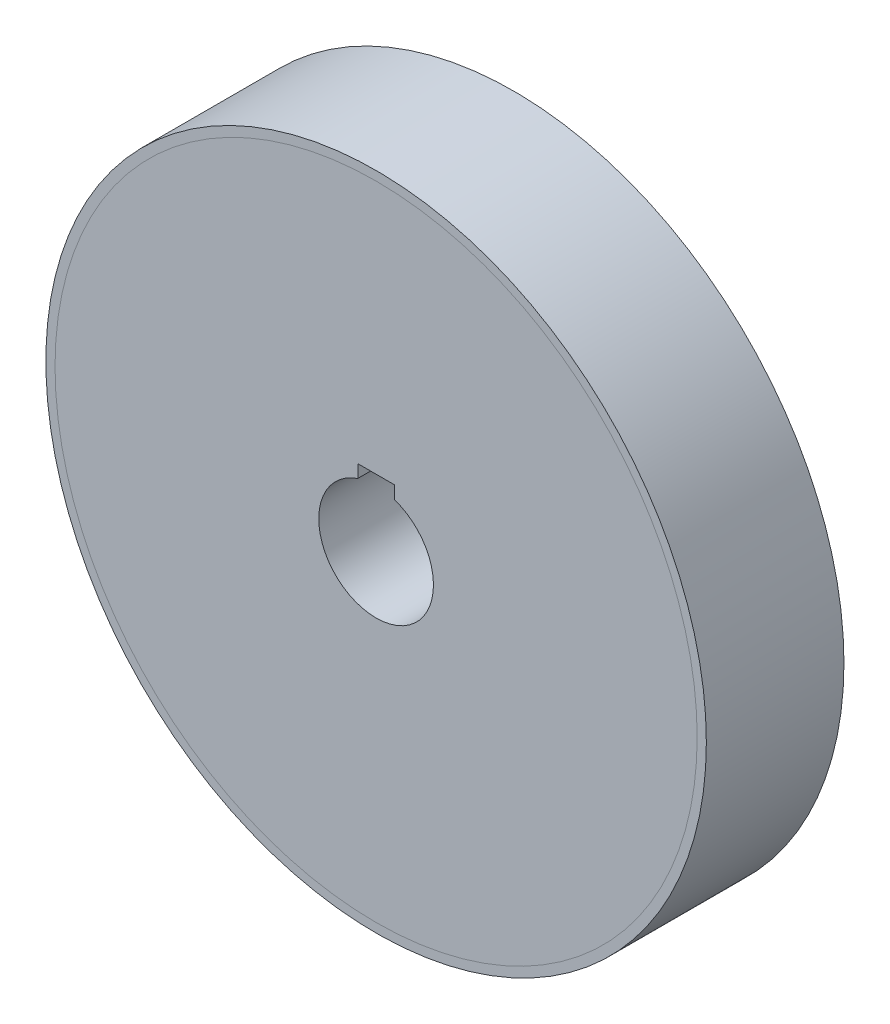
ISO-10303-21;
HEADER;
FILE_DESCRIPTION(('STEP AP214'),'2;1');
FILE_NAME('part.step','',(''),(''),'','','');
FILE_SCHEMA(('AUTOMOTIVE_DESIGN { 1 0 10303 214 1 1 1 1 }'));
ENDSEC;
DATA;
#1=APPLICATION_CONTEXT('core data for automotive mechanical design processes');
#2=APPLICATION_PROTOCOL_DEFINITION('international standard','automotive_design',2000,#1);
#3=PRODUCT_CONTEXT('',#1,'mechanical');
#4=PRODUCT('Part','Part','',(#3));
#5=PRODUCT_RELATED_PRODUCT_CATEGORY('part','',(#4));
#6=PRODUCT_DEFINITION_FORMATION('','',#4);
#7=PRODUCT_DEFINITION_CONTEXT('part definition',#1,'design');
#8=PRODUCT_DEFINITION('design','',#6,#7);
#9=PRODUCT_DEFINITION_SHAPE('','',#8);
#10=(LENGTH_UNIT() NAMED_UNIT(*) SI_UNIT(.MILLI.,.METRE.));
#11=(NAMED_UNIT(*) PLANE_ANGLE_UNIT() SI_UNIT($,.RADIAN.));
#12=(NAMED_UNIT(*) SI_UNIT($,.STERADIAN.) SOLID_ANGLE_UNIT());
#13=UNCERTAINTY_MEASURE_WITH_UNIT(LENGTH_MEASURE(1.E-05),#10,'distance_accuracy_value','');
#14=(GEOMETRIC_REPRESENTATION_CONTEXT(3) GLOBAL_UNCERTAINTY_ASSIGNED_CONTEXT((#13)) GLOBAL_UNIT_ASSIGNED_CONTEXT((#10,
#11,#12)) REPRESENTATION_CONTEXT('',''));
#15=CARTESIAN_POINT('',(0.,0.,0.));
#16=DIRECTION('',(0.,0.,1.));
#17=DIRECTION('',(1.,0.,0.));
#18=AXIS2_PLACEMENT_3D('',#15,#16,#17);
#19=CARTESIAN_POINT('',(0.,0.,-407.293505963451));
#20=DIRECTION('',(0.,0.,1.));
#21=DIRECTION('',(1.,0.,0.));
#22=AXIS2_PLACEMENT_3D('',#19,#20,#21);
#23=CYLINDRICAL_SURFACE('',#22,144.);
#24=CARTESIAN_POINT('',(0.,0.,0.));
#25=DIRECTION('',(0.,0.,1.));
#26=DIRECTION('',(1.,0.,0.));
#27=AXIS2_PLACEMENT_3D('',#24,#25,#26);
#28=CIRCLE('',#27,144.);
#29=CARTESIAN_POINT('',(144.,0.,0.));
#30=VERTEX_POINT('',#29);
#31=EDGE_CURVE('E64',#30,#30,#28,.F.);
#32=ORIENTED_EDGE('',*,*,#31,.F.);
#33=EDGE_LOOP('',(#32));
#34=FACE_BOUND('',#33,.T.);
#35=CARTESIAN_POINT('',(0.,0.,60.));
#36=DIRECTION('',(0.,0.,1.));
#37=DIRECTION('',(1.,0.,0.));
#38=AXIS2_PLACEMENT_3D('',#35,#36,#37);
#39=CIRCLE('',#38,144.);
#40=CARTESIAN_POINT('',(144.,0.,60.));
#41=VERTEX_POINT('',#40);
#42=EDGE_CURVE('E68',#41,#41,#39,.T.);
#43=ORIENTED_EDGE('',*,*,#42,.F.);
#44=EDGE_LOOP('',(#43));
#45=FACE_BOUND('',#44,.T.);
#46=ADVANCED_FACE('F58',(#34,#45),#23,.T.);
#47=CARTESIAN_POINT('',(0.,0.,60.));
#48=DIRECTION('',(0.,0.,1.));
#49=DIRECTION('',(1.,0.,0.));
#50=AXIS2_PLACEMENT_3D('',#47,#48,#49);
#51=PLANE('',#50);
#52=CARTESIAN_POINT('',(0.,0.,60.));
#53=DIRECTION('',(0.,0.,1.));
#54=DIRECTION('',(1.,0.,0.));
#55=AXIS2_PLACEMENT_3D('',#52,#53,#54);
#56=CIRCLE('',#55,140.);
#57=CARTESIAN_POINT('',(140.,0.,60.));
#58=VERTEX_POINT('',#57);
#59=EDGE_CURVE('E73',#58,#58,#56,.T.);
#60=ORIENTED_EDGE('',*,*,#59,.F.);
#61=EDGE_LOOP('',(#60));
#62=FACE_BOUND('',#61,.T.);
#63=ORIENTED_EDGE('',*,*,#42,.T.);
#64=EDGE_LOOP('',(#63));
#65=FACE_BOUND('',#64,.T.);
#66=ADVANCED_FACE('F80',(#62,#65),#51,.T.);
#67=CARTESIAN_POINT('',(0.,0.,-407.293505963451));
#68=DIRECTION('',(0.,0.,1.));
#69=DIRECTION('',(1.,0.,0.));
#70=AXIS2_PLACEMENT_3D('',#67,#68,#69);
#71=CYLINDRICAL_SURFACE('',#70,140.);
#72=CARTESIAN_POINT('',(0.,0.,0.));
#73=DIRECTION('',(0.,0.,1.));
#74=DIRECTION('',(1.,0.,0.));
#75=AXIS2_PLACEMENT_3D('',#72,#73,#74);
#76=CIRCLE('',#75,140.);
#77=CARTESIAN_POINT('',(140.,0.,0.));
#78=VERTEX_POINT('',#77);
#79=EDGE_CURVE('E13',#78,#78,#76,.F.);
#80=ORIENTED_EDGE('',*,*,#79,.T.);
#81=EDGE_LOOP('',(#80));
#82=FACE_BOUND('',#81,.T.);
#83=ORIENTED_EDGE('',*,*,#59,.T.);
#84=EDGE_LOOP('',(#83));
#85=FACE_BOUND('',#84,.T.);
#86=ADVANCED_FACE('F78',(#82,#85),#71,.F.);
#87=CARTESIAN_POINT('',(0.,0.,0.));
#88=DIRECTION('',(0.,0.,1.));
#89=DIRECTION('',(1.,0.,0.));
#90=AXIS2_PLACEMENT_3D('',#87,#88,#89);
#91=PLANE('',#90);
#92=ORIENTED_EDGE('',*,*,#31,.T.);
#93=EDGE_LOOP('',(#92));
#94=FACE_BOUND('',#93,.T.);
#95=ORIENTED_EDGE('',*,*,#79,.F.);
#96=EDGE_LOOP('',(#95));
#97=FACE_BOUND('',#96,.T.);
#98=ADVANCED_FACE('F99',(#94,#97),#91,.F.);
#99=CLOSED_SHELL('',(#46,#66,#86,#98));
#100=MANIFOLD_SOLID_BREP('B2',#99);
#101=CARTESIAN_POINT('',(0.,0.,60.));
#102=DIRECTION('',(0.,0.,-1.));
#103=DIRECTION('',(-1.,0.,0.));
#104=AXIS2_PLACEMENT_3D('',#101,#102,#103);
#105=CYLINDRICAL_SURFACE('',#104,140.);
#106=CARTESIAN_POINT('',(0.,0.,60.));
#107=DIRECTION('',(0.,0.,1.));
#108=DIRECTION('',(1.,0.,0.));
#109=AXIS2_PLACEMENT_3D('',#106,#107,#108);
#110=CIRCLE('',#109,140.);
#111=CARTESIAN_POINT('',(140.,0.,60.));
#112=VERTEX_POINT('',#111);
#113=EDGE_CURVE('E56',#112,#112,#110,.T.);
#114=ORIENTED_EDGE('',*,*,#113,.F.);
#115=EDGE_LOOP('',(#114));
#116=FACE_BOUND('',#115,.T.);
#117=CARTESIAN_POINT('',(0.,0.,0.));
#118=DIRECTION('',(0.,0.,1.));
#119=DIRECTION('',(1.,0.,0.));
#120=AXIS2_PLACEMENT_3D('',#117,#118,#119);
#121=CIRCLE('',#120,140.);
#122=CARTESIAN_POINT('',(140.,0.,0.));
#123=VERTEX_POINT('',#122);
#124=EDGE_CURVE('E120',#123,#123,#121,.T.);
#125=ORIENTED_EDGE('',*,*,#124,.T.);
#126=EDGE_LOOP('',(#125));
#127=FACE_BOUND('',#126,.T.);
#128=ADVANCED_FACE('F117',(#116,#127),#105,.T.);
#129=CARTESIAN_POINT('',(0.,0.,60.));
#130=DIRECTION('',(0.,0.,1.));
#131=DIRECTION('',(1.,0.,0.));
#132=AXIS2_PLACEMENT_3D('',#129,#130,#131);
#133=PLANE('',#132);
#134=DIRECTION('',(0.,-1.,0.));
#135=VECTOR('',#134,1.);
#136=CARTESIAN_POINT('',(-8.,23.685438564654,60.));
#137=LINE('',#136,#135);
#138=CARTESIAN_POINT('',(-8.,29.3,60.));
#139=VERTEX_POINT('',#138);
#140=CARTESIAN_POINT('',(-8.,23.685438564654,60.));
#141=VERTEX_POINT('',#140);
#142=EDGE_CURVE('E156',#139,#141,#137,.T.);
#143=ORIENTED_EDGE('',*,*,#142,.F.);
#144=DIRECTION('',(-1.,0.,0.));
#145=VECTOR('',#144,1.);
#146=CARTESIAN_POINT('',(-8.,29.3,60.));
#147=LINE('',#146,#145);
#148=CARTESIAN_POINT('',(8.,29.3,60.));
#149=VERTEX_POINT('',#148);
#150=EDGE_CURVE('E181',#149,#139,#147,.T.);
#151=ORIENTED_EDGE('',*,*,#150,.F.);
#152=DIRECTION('',(0.,1.,0.));
#153=VECTOR('',#152,1.);
#154=CARTESIAN_POINT('',(8.,23.685438564654,60.));
#155=LINE('',#154,#153);
#156=CARTESIAN_POINT('',(8.,23.685438564654,60.));
#157=VERTEX_POINT('',#156);
#158=EDGE_CURVE('E162',#157,#149,#155,.T.);
#159=ORIENTED_EDGE('',*,*,#158,.F.);
#160=CARTESIAN_POINT('',(0.,0.,60.));
#161=DIRECTION('',(0.,0.,1.));
#162=DIRECTION('',(1.,0.,0.));
#163=AXIS2_PLACEMENT_3D('',#160,#161,#162);
#164=CIRCLE('',#163,25.);
#165=EDGE_CURVE('E188',#141,#157,#164,.T.);
#166=ORIENTED_EDGE('',*,*,#165,.F.);
#167=EDGE_LOOP('',(#143,#151,#159,#166));
#168=FACE_BOUND('',#167,.T.);
#169=ORIENTED_EDGE('',*,*,#113,.T.);
#170=EDGE_LOOP('',(#169));
#171=FACE_BOUND('',#170,.T.);
#172=ADVANCED_FACE('F197',(#168,#171),#133,.T.);
#173=CARTESIAN_POINT('',(0.,0.,0.));
#174=DIRECTION('',(0.,0.,1.));
#175=DIRECTION('',(1.,0.,0.));
#176=AXIS2_PLACEMENT_3D('',#173,#174,#175);
#177=PLANE('',#176);
#178=DIRECTION('',(-1.,0.,0.));
#179=VECTOR('',#178,1.);
#180=CARTESIAN_POINT('',(-8.,29.3,0.));
#181=LINE('',#180,#179);
#182=CARTESIAN_POINT('',(8.,29.3,0.));
#183=VERTEX_POINT('',#182);
#184=CARTESIAN_POINT('',(-8.,29.3,0.));
#185=VERTEX_POINT('',#184);
#186=EDGE_CURVE('E170',#183,#185,#181,.T.);
#187=ORIENTED_EDGE('',*,*,#186,.T.);
#188=DIRECTION('',(0.,-1.,0.));
#189=VECTOR('',#188,1.);
#190=CARTESIAN_POINT('',(-8.,23.685438564654,0.));
#191=LINE('',#190,#189);
#192=CARTESIAN_POINT('',(-8.,23.685438564654,0.));
#193=VERTEX_POINT('',#192);
#194=EDGE_CURVE('E173',#185,#193,#191,.T.);
#195=ORIENTED_EDGE('',*,*,#194,.T.);
#196=CARTESIAN_POINT('',(0.,0.,0.));
#197=DIRECTION('',(0.,0.,1.));
#198=DIRECTION('',(1.,0.,0.));
#199=AXIS2_PLACEMENT_3D('',#196,#197,#198);
#200=CIRCLE('',#199,25.);
#201=CARTESIAN_POINT('',(8.,23.685438564654,0.));
#202=VERTEX_POINT('',#201);
#203=EDGE_CURVE('E179',#193,#202,#200,.T.);
#204=ORIENTED_EDGE('',*,*,#203,.T.);
#205=DIRECTION('',(0.,1.,0.));
#206=VECTOR('',#205,1.);
#207=CARTESIAN_POINT('',(8.,23.685438564654,0.));
#208=LINE('',#207,#206);
#209=EDGE_CURVE('E131',#202,#183,#208,.T.);
#210=ORIENTED_EDGE('',*,*,#209,.T.);
#211=EDGE_LOOP('',(#187,#195,#204,#210));
#212=FACE_BOUND('',#211,.T.);
#213=ORIENTED_EDGE('',*,*,#124,.F.);
#214=EDGE_LOOP('',(#213));
#215=FACE_BOUND('',#214,.T.);
#216=ADVANCED_FACE('F176',(#212,#215),#177,.F.);
#217=CARTESIAN_POINT('',(0.,0.,0.));
#218=DIRECTION('',(0.,0.,1.));
#219=DIRECTION('',(1.,0.,0.));
#220=AXIS2_PLACEMENT_3D('',#217,#218,#219);
#221=CYLINDRICAL_SURFACE('',#220,25.);
#222=ORIENTED_EDGE('',*,*,#203,.F.);
#223=DIRECTION('',(0.,0.,1.));
#224=VECTOR('',#223,1.);
#225=CARTESIAN_POINT('',(-8.,23.685438564654,0.));
#226=LINE('',#225,#224);
#227=EDGE_CURVE('E140',#193,#141,#226,.T.);
#228=ORIENTED_EDGE('',*,*,#227,.T.);
#229=ORIENTED_EDGE('',*,*,#165,.T.);
#230=DIRECTION('',(0.,0.,1.));
#231=VECTOR('',#230,1.);
#232=CARTESIAN_POINT('',(8.,23.685438564654,0.));
#233=LINE('',#232,#231);
#234=EDGE_CURVE('E167',#202,#157,#233,.T.);
#235=ORIENTED_EDGE('',*,*,#234,.F.);
#236=EDGE_LOOP('',(#222,#228,#229,#235));
#237=FACE_BOUND('',#236,.T.);
#238=ADVANCED_FACE('F195',(#237),#221,.F.);
#239=CARTESIAN_POINT('',(-8.,23.685438564654,0.));
#240=DIRECTION('',(-1.,0.,0.));
#241=DIRECTION('',(0.,0.,1.));
#242=AXIS2_PLACEMENT_3D('',#239,#240,#241);
#243=PLANE('',#242);
#244=ORIENTED_EDGE('',*,*,#142,.T.);
#245=ORIENTED_EDGE('',*,*,#227,.F.);
#246=ORIENTED_EDGE('',*,*,#194,.F.);
#247=DIRECTION('',(0.,0.,1.));
#248=VECTOR('',#247,1.);
#249=CARTESIAN_POINT('',(-8.,29.3,0.));
#250=LINE('',#249,#248);
#251=EDGE_CURVE('E166',#185,#139,#250,.T.);
#252=ORIENTED_EDGE('',*,*,#251,.T.);
#253=EDGE_LOOP('',(#244,#245,#246,#252));
#254=FACE_BOUND('',#253,.T.);
#255=ADVANCED_FACE('F211',(#254),#243,.F.);
#256=CARTESIAN_POINT('',(-8.,29.3,0.));
#257=DIRECTION('',(0.,1.,0.));
#258=DIRECTION('',(0.,0.,1.));
#259=AXIS2_PLACEMENT_3D('',#256,#257,#258);
#260=PLANE('',#259);
#261=ORIENTED_EDGE('',*,*,#150,.T.);
#262=ORIENTED_EDGE('',*,*,#251,.F.);
#263=ORIENTED_EDGE('',*,*,#186,.F.);
#264=DIRECTION('',(0.,0.,1.));
#265=VECTOR('',#264,1.);
#266=CARTESIAN_POINT('',(8.,29.3,0.));
#267=LINE('',#266,#265);
#268=EDGE_CURVE('E158',#183,#149,#267,.T.);
#269=ORIENTED_EDGE('',*,*,#268,.T.);
#270=EDGE_LOOP('',(#261,#262,#263,#269));
#271=FACE_BOUND('',#270,.T.);
#272=ADVANCED_FACE('F171',(#271),#260,.F.);
#273=CARTESIAN_POINT('',(8.,23.685438564654,0.));
#274=DIRECTION('',(1.,0.,0.));
#275=DIRECTION('',(0.,0.,-1.));
#276=AXIS2_PLACEMENT_3D('',#273,#274,#275);
#277=PLANE('',#276);
#278=ORIENTED_EDGE('',*,*,#158,.T.);
#279=ORIENTED_EDGE('',*,*,#268,.F.);
#280=ORIENTED_EDGE('',*,*,#209,.F.);
#281=ORIENTED_EDGE('',*,*,#234,.T.);
#282=EDGE_LOOP('',(#278,#279,#280,#281));
#283=FACE_BOUND('',#282,.T.);
#284=ADVANCED_FACE('F160',(#283),#277,.F.);
#285=CLOSED_SHELL('',(#128,#172,#216,#238,#255,#272,#284));
#286=MANIFOLD_SOLID_BREP('B8',#285);
#287=ADVANCED_BREP_SHAPE_REPRESENTATION('',(#18,#100,#286),#14);
#288=SHAPE_DEFINITION_REPRESENTATION(#9,#287);
ENDSEC;
END-ISO-10303-21;
